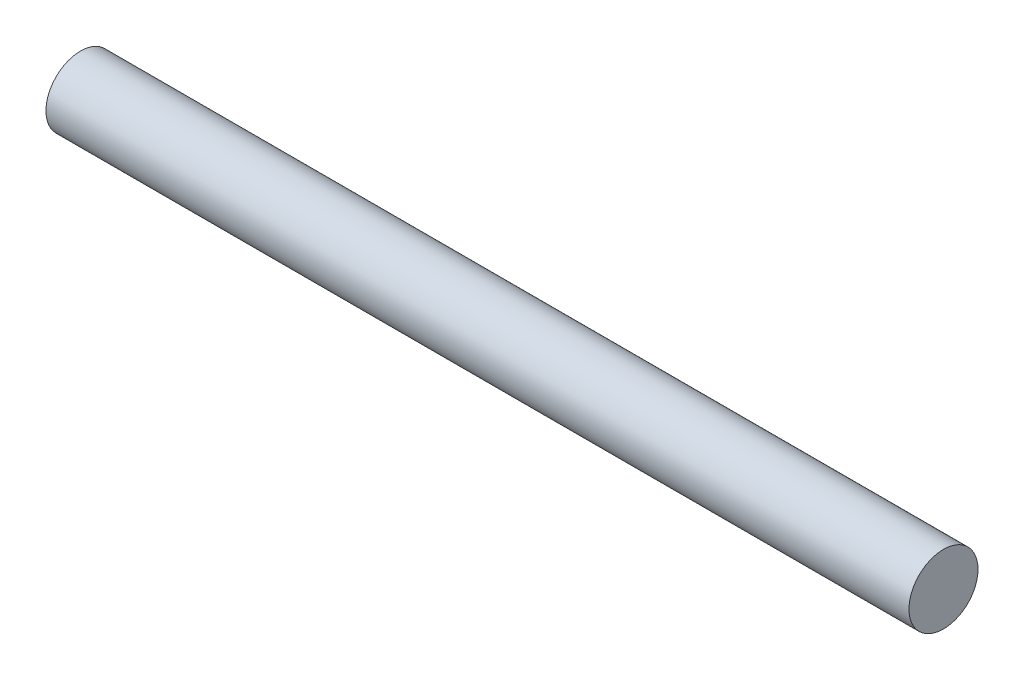
ISO-10303-21;
HEADER;
FILE_DESCRIPTION(('STEP AP214'),'2;1');
FILE_NAME('part.step','',(''),(''),'','','');
FILE_SCHEMA(('AUTOMOTIVE_DESIGN { 1 0 10303 214 1 1 1 1 }'));
ENDSEC;
DATA;
#1=APPLICATION_CONTEXT('core data for automotive mechanical design processes');
#2=APPLICATION_PROTOCOL_DEFINITION('international standard','automotive_design',2000,#1);
#3=PRODUCT_CONTEXT('',#1,'mechanical');
#4=PRODUCT('Part','Part','',(#3));
#5=PRODUCT_RELATED_PRODUCT_CATEGORY('part','',(#4));
#6=PRODUCT_DEFINITION_FORMATION('','',#4);
#7=PRODUCT_DEFINITION_CONTEXT('part definition',#1,'design');
#8=PRODUCT_DEFINITION('design','',#6,#7);
#9=PRODUCT_DEFINITION_SHAPE('','',#8);
#10=(LENGTH_UNIT() NAMED_UNIT(*) SI_UNIT(.MILLI.,.METRE.));
#11=(NAMED_UNIT(*) PLANE_ANGLE_UNIT() SI_UNIT($,.RADIAN.));
#12=(NAMED_UNIT(*) SI_UNIT($,.STERADIAN.) SOLID_ANGLE_UNIT());
#13=UNCERTAINTY_MEASURE_WITH_UNIT(LENGTH_MEASURE(1.E-05),#10,'distance_accuracy_value','');
#14=(GEOMETRIC_REPRESENTATION_CONTEXT(3) GLOBAL_UNCERTAINTY_ASSIGNED_CONTEXT((#13)) GLOBAL_UNIT_ASSIGNED_CONTEXT((#10,
#11,#12)) REPRESENTATION_CONTEXT('',''));
#15=CARTESIAN_POINT('',(0.,0.,0.));
#16=DIRECTION('',(0.,0.,1.));
#17=DIRECTION('',(1.,0.,0.));
#18=AXIS2_PLACEMENT_3D('',#15,#16,#17);
#19=CARTESIAN_POINT('',(50.,0.,0.));
#20=DIRECTION('',(-1.,0.,0.));
#21=DIRECTION('',(0.,0.,1.));
#22=AXIS2_PLACEMENT_3D('',#19,#20,#21);
#23=CYLINDRICAL_SURFACE('',#22,4.);
#24=CARTESIAN_POINT('',(50.,0.,0.));
#25=DIRECTION('',(1.,0.,0.));
#26=DIRECTION('',(0.,0.,-1.));
#27=AXIS2_PLACEMENT_3D('',#24,#25,#26);
#28=CIRCLE('',#27,4.);
#29=CARTESIAN_POINT('',(50.,0.,-4.));
#30=VERTEX_POINT('',#29);
#31=EDGE_CURVE('E10',#30,#30,#28,.T.);
#32=ORIENTED_EDGE('',*,*,#31,.F.);
#33=EDGE_LOOP('',(#32));
#34=FACE_BOUND('',#33,.T.);
#35=CARTESIAN_POINT('',(-50.,0.,0.));
#36=DIRECTION('',(1.,0.,0.));
#37=DIRECTION('',(0.,0.,-1.));
#38=AXIS2_PLACEMENT_3D('',#35,#36,#37);
#39=CIRCLE('',#38,4.);
#40=CARTESIAN_POINT('',(-50.,0.,-4.));
#41=VERTEX_POINT('',#40);
#42=EDGE_CURVE('E40',#41,#41,#39,.T.);
#43=ORIENTED_EDGE('',*,*,#42,.T.);
#44=EDGE_LOOP('',(#43));
#45=FACE_BOUND('',#44,.T.);
#46=ADVANCED_FACE('F37',(#34,#45),#23,.T.);
#47=CARTESIAN_POINT('',(50.,0.,0.));
#48=DIRECTION('',(1.,0.,0.));
#49=DIRECTION('',(0.,0.,-1.));
#50=AXIS2_PLACEMENT_3D('',#47,#48,#49);
#51=PLANE('',#50);
#52=ORIENTED_EDGE('',*,*,#31,.T.);
#53=EDGE_LOOP('',(#52));
#54=FACE_BOUND('',#53,.T.);
#55=ADVANCED_FACE('F54',(#54),#51,.T.);
#56=CARTESIAN_POINT('',(-50.,0.,0.));
#57=DIRECTION('',(1.,0.,0.));
#58=DIRECTION('',(0.,0.,-1.));
#59=AXIS2_PLACEMENT_3D('',#56,#57,#58);
#60=PLANE('',#59);
#61=ORIENTED_EDGE('',*,*,#42,.F.);
#62=EDGE_LOOP('',(#61));
#63=FACE_BOUND('',#62,.T.);
#64=ADVANCED_FACE('F52',(#63),#60,.F.);
#65=CLOSED_SHELL('',(#46,#55,#64));
#66=MANIFOLD_SOLID_BREP('B2',#65);
#67=ADVANCED_BREP_SHAPE_REPRESENTATION('',(#18,#66),#14);
#68=SHAPE_DEFINITION_REPRESENTATION(#9,#67);
ENDSEC;
END-ISO-10303-21;
